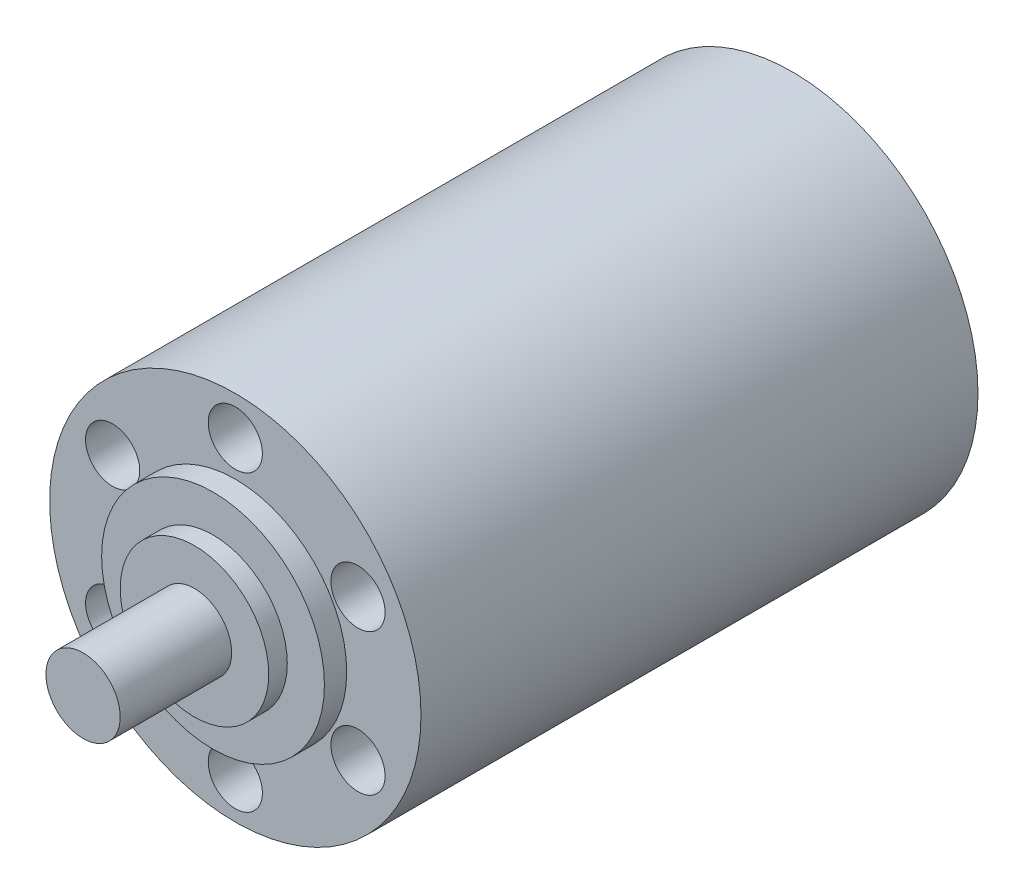
ISO-10303-21;
HEADER;
FILE_DESCRIPTION(('STEP AP214'),'2;1');
FILE_NAME('part.step','',(''),(''),'','','');
FILE_SCHEMA(('AUTOMOTIVE_DESIGN { 1 0 10303 214 1 1 1 1 }'));
ENDSEC;
DATA;
#1=APPLICATION_CONTEXT('core data for automotive mechanical design processes');
#2=APPLICATION_PROTOCOL_DEFINITION('international standard','automotive_design',2000,#1);
#3=PRODUCT_CONTEXT('',#1,'mechanical');
#4=PRODUCT('Part','Part','',(#3));
#5=PRODUCT_RELATED_PRODUCT_CATEGORY('part','',(#4));
#6=PRODUCT_DEFINITION_FORMATION('','',#4);
#7=PRODUCT_DEFINITION_CONTEXT('part definition',#1,'design');
#8=PRODUCT_DEFINITION('design','',#6,#7);
#9=PRODUCT_DEFINITION_SHAPE('','',#8);
#10=(LENGTH_UNIT() NAMED_UNIT(*) SI_UNIT(.MILLI.,.METRE.));
#11=(NAMED_UNIT(*) PLANE_ANGLE_UNIT() SI_UNIT($,.RADIAN.));
#12=(NAMED_UNIT(*) SI_UNIT($,.STERADIAN.) SOLID_ANGLE_UNIT());
#13=UNCERTAINTY_MEASURE_WITH_UNIT(LENGTH_MEASURE(1.E-05),#10,'distance_accuracy_value','');
#14=(GEOMETRIC_REPRESENTATION_CONTEXT(3) GLOBAL_UNCERTAINTY_ASSIGNED_CONTEXT((#13)) GLOBAL_UNIT_ASSIGNED_CONTEXT((#10,
#11,#12)) REPRESENTATION_CONTEXT('',''));
#15=CARTESIAN_POINT('',(0.,0.,0.));
#16=DIRECTION('',(0.,0.,1.));
#17=DIRECTION('',(1.,0.,0.));
#18=AXIS2_PLACEMENT_3D('',#15,#16,#17);
#19=CARTESIAN_POINT('',(0.,0.,150.));
#20=DIRECTION('',(0.,0.,-1.));
#21=DIRECTION('',(-1.,0.,0.));
#22=AXIS2_PLACEMENT_3D('',#19,#20,#21);
#23=CYLINDRICAL_SURFACE('',#22,50.);
#24=CARTESIAN_POINT('',(0.,0.,150.));
#25=DIRECTION('',(0.,0.,1.));
#26=DIRECTION('',(1.,0.,0.));
#27=AXIS2_PLACEMENT_3D('',#24,#25,#26);
#28=CIRCLE('',#27,50.);
#29=CARTESIAN_POINT('',(50.,0.,150.));
#30=VERTEX_POINT('',#29);
#31=EDGE_CURVE('E58',#30,#30,#28,.T.);
#32=ORIENTED_EDGE('',*,*,#31,.F.);
#33=EDGE_LOOP('',(#32));
#34=FACE_BOUND('',#33,.T.);
#35=CARTESIAN_POINT('',(0.,0.,0.));
#36=DIRECTION('',(0.,0.,1.));
#37=DIRECTION('',(1.,0.,0.));
#38=AXIS2_PLACEMENT_3D('',#35,#36,#37);
#39=CIRCLE('',#38,50.);
#40=CARTESIAN_POINT('',(50.,0.,0.));
#41=VERTEX_POINT('',#40);
#42=EDGE_CURVE('E36',#41,#41,#39,.T.);
#43=ORIENTED_EDGE('',*,*,#42,.T.);
#44=EDGE_LOOP('',(#43));
#45=FACE_BOUND('',#44,.T.);
#46=ADVANCED_FACE('F33',(#34,#45),#23,.T.);
#47=CARTESIAN_POINT('',(0.,0.,150.));
#48=DIRECTION('',(0.,0.,1.));
#49=DIRECTION('',(1.,0.,0.));
#50=AXIS2_PLACEMENT_3D('',#47,#48,#49);
#51=PLANE('',#50);
#52=CARTESIAN_POINT('',(0.,39.5741246169116,150.));
#53=DIRECTION('',(0.,0.,1.));
#54=DIRECTION('',(1.,0.,0.));
#55=AXIS2_PLACEMENT_3D('',#52,#53,#54);
#56=CIRCLE('',#55,7.29301710738582);
#57=CARTESIAN_POINT('',(7.29301710738582,39.5741246169116,150.));
#58=VERTEX_POINT('',#57);
#59=EDGE_CURVE('E283',#58,#58,#56,.T.);
#60=ORIENTED_EDGE('',*,*,#59,.F.);
#61=EDGE_LOOP('',(#60));
#62=FACE_BOUND('',#61,.T.);
#63=CARTESIAN_POINT('',(-33.0372685802872,-19.0740759081187,150.));
#64=DIRECTION('',(0.,0.,1.));
#65=DIRECTION('',(1.,0.,0.));
#66=AXIS2_PLACEMENT_3D('',#63,#64,#65);
#67=CIRCLE('',#66,7.29301710738582);
#68=CARTESIAN_POINT('',(-25.7442514729014,-19.0740759081187,150.));
#69=VERTEX_POINT('',#68);
#70=EDGE_CURVE('E294',#69,#69,#67,.T.);
#71=ORIENTED_EDGE('',*,*,#70,.F.);
#72=EDGE_LOOP('',(#71));
#73=FACE_BOUND('',#72,.T.);
#74=CARTESIAN_POINT('',(33.0372685802872,19.0740759081187,150.));
#75=DIRECTION('',(0.,0.,1.));
#76=DIRECTION('',(1.,0.,0.));
#77=AXIS2_PLACEMENT_3D('',#74,#75,#76);
#78=CIRCLE('',#77,7.29301710738582);
#79=CARTESIAN_POINT('',(40.330285687673,19.0740759081187,150.));
#80=VERTEX_POINT('',#79);
#81=EDGE_CURVE('E311',#80,#80,#78,.T.);
#82=ORIENTED_EDGE('',*,*,#81,.F.);
#83=EDGE_LOOP('',(#82));
#84=FACE_BOUND('',#83,.T.);
#85=CARTESIAN_POINT('',(0.,-39.5741246169116,150.));
#86=DIRECTION('',(0.,0.,1.));
#87=DIRECTION('',(-1.,0.,0.));
#88=AXIS2_PLACEMENT_3D('',#85,#86,#87);
#89=CIRCLE('',#88,7.29301710738582);
#90=CARTESIAN_POINT('',(-7.29301710738582,-39.5741246169116,150.));
#91=VERTEX_POINT('',#90);
#92=EDGE_CURVE('E300',#91,#91,#89,.T.);
#93=ORIENTED_EDGE('',*,*,#92,.F.);
#94=EDGE_LOOP('',(#93));
#95=FACE_BOUND('',#94,.T.);
#96=CARTESIAN_POINT('',(-33.0372685802872,19.0740759081187,150.));
#97=DIRECTION('',(0.,0.,1.));
#98=DIRECTION('',(-1.,0.,0.));
#99=AXIS2_PLACEMENT_3D('',#96,#97,#98);
#100=CIRCLE('',#99,7.29301710738582);
#101=CARTESIAN_POINT('',(-40.330285687673,19.0740759081187,150.));
#102=VERTEX_POINT('',#101);
#103=EDGE_CURVE('E301',#102,#102,#100,.T.);
#104=ORIENTED_EDGE('',*,*,#103,.F.);
#105=EDGE_LOOP('',(#104));
#106=FACE_BOUND('',#105,.T.);
#107=CARTESIAN_POINT('',(33.0372685802872,-19.0740759081187,150.));
#108=DIRECTION('',(0.,0.,1.));
#109=DIRECTION('',(-1.,0.,0.));
#110=AXIS2_PLACEMENT_3D('',#107,#108,#109);
#111=CIRCLE('',#110,7.29301710738582);
#112=CARTESIAN_POINT('',(25.7442514729014,-19.0740759081187,150.));
#113=VERTEX_POINT('',#112);
#114=EDGE_CURVE('E293',#113,#113,#111,.T.);
#115=ORIENTED_EDGE('',*,*,#114,.F.);
#116=EDGE_LOOP('',(#115));
#117=FACE_BOUND('',#116,.T.);
#118=CARTESIAN_POINT('',(0.,0.,150.));
#119=DIRECTION('',(0.,0.,1.));
#120=DIRECTION('',(1.,0.,0.));
#121=AXIS2_PLACEMENT_3D('',#118,#119,#120);
#122=CIRCLE('',#121,30.);
#123=CARTESIAN_POINT('',(30.,0.,150.));
#124=VERTEX_POINT('',#123);
#125=EDGE_CURVE('E45',#124,#124,#122,.T.);
#126=ORIENTED_EDGE('',*,*,#125,.F.);
#127=EDGE_LOOP('',(#126));
#128=FACE_BOUND('',#127,.T.);
#129=ORIENTED_EDGE('',*,*,#31,.T.);
#130=EDGE_LOOP('',(#129));
#131=FACE_BOUND('',#130,.T.);
#132=ADVANCED_FACE('F69',(#62,#73,#84,#95,#106,#117,#128,#131),#51,.T.);
#133=CARTESIAN_POINT('',(0.,0.,0.));
#134=DIRECTION('',(0.,0.,1.));
#135=DIRECTION('',(1.,0.,0.));
#136=AXIS2_PLACEMENT_3D('',#133,#134,#135);
#137=PLANE('',#136);
#138=ORIENTED_EDGE('',*,*,#42,.F.);
#139=EDGE_LOOP('',(#138));
#140=FACE_BOUND('',#139,.T.);
#141=ADVANCED_FACE('F66',(#140),#137,.F.);
#142=CARTESIAN_POINT('',(0.,0.,156.));
#143=DIRECTION('',(0.,0.,-1.));
#144=DIRECTION('',(-1.,0.,0.));
#145=AXIS2_PLACEMENT_3D('',#142,#143,#144);
#146=CYLINDRICAL_SURFACE('',#145,30.);
#147=CARTESIAN_POINT('',(0.,0.,156.));
#148=DIRECTION('',(0.,0.,1.));
#149=DIRECTION('',(1.,0.,0.));
#150=AXIS2_PLACEMENT_3D('',#147,#148,#149);
#151=CIRCLE('',#150,30.);
#152=CARTESIAN_POINT('',(30.,0.,156.));
#153=VERTEX_POINT('',#152);
#154=EDGE_CURVE('E53',#153,#153,#151,.T.);
#155=ORIENTED_EDGE('',*,*,#154,.F.);
#156=EDGE_LOOP('',(#155));
#157=FACE_BOUND('',#156,.T.);
#158=ORIENTED_EDGE('',*,*,#125,.T.);
#159=EDGE_LOOP('',(#158));
#160=FACE_BOUND('',#159,.T.);
#161=ADVANCED_FACE('F68',(#157,#160),#146,.T.);
#162=CARTESIAN_POINT('',(0.,0.,156.));
#163=DIRECTION('',(0.,0.,1.));
#164=DIRECTION('',(1.,0.,0.));
#165=AXIS2_PLACEMENT_3D('',#162,#163,#164);
#166=PLANE('',#165);
#167=CARTESIAN_POINT('',(0.,0.,156.));
#168=DIRECTION('',(0.,0.,1.));
#169=DIRECTION('',(1.,0.,0.));
#170=AXIS2_PLACEMENT_3D('',#167,#168,#169);
#171=CIRCLE('',#170,20.);
#172=CARTESIAN_POINT('',(20.,0.,156.));
#173=VERTEX_POINT('',#172);
#174=EDGE_CURVE('E40',#173,#173,#171,.T.);
#175=ORIENTED_EDGE('',*,*,#174,.F.);
#176=EDGE_LOOP('',(#175));
#177=FACE_BOUND('',#176,.T.);
#178=ORIENTED_EDGE('',*,*,#154,.T.);
#179=EDGE_LOOP('',(#178));
#180=FACE_BOUND('',#179,.T.);
#181=ADVANCED_FACE('F74',(#177,#180),#166,.T.);
#182=CARTESIAN_POINT('',(0.,0.,161.));
#183=DIRECTION('',(0.,0.,-1.));
#184=DIRECTION('',(-1.,0.,0.));
#185=AXIS2_PLACEMENT_3D('',#182,#183,#184);
#186=CYLINDRICAL_SURFACE('',#185,20.);
#187=CARTESIAN_POINT('',(0.,0.,161.));
#188=DIRECTION('',(0.,0.,1.));
#189=DIRECTION('',(1.,0.,0.));
#190=AXIS2_PLACEMENT_3D('',#187,#188,#189);
#191=CIRCLE('',#190,20.);
#192=CARTESIAN_POINT('',(20.,0.,161.));
#193=VERTEX_POINT('',#192);
#194=EDGE_CURVE('E51',#193,#193,#191,.T.);
#195=ORIENTED_EDGE('',*,*,#194,.F.);
#196=EDGE_LOOP('',(#195));
#197=FACE_BOUND('',#196,.T.);
#198=ORIENTED_EDGE('',*,*,#174,.T.);
#199=EDGE_LOOP('',(#198));
#200=FACE_BOUND('',#199,.T.);
#201=ADVANCED_FACE('F229',(#197,#200),#186,.T.);
#202=CARTESIAN_POINT('',(0.,0.,161.));
#203=DIRECTION('',(0.,0.,1.));
#204=DIRECTION('',(1.,0.,0.));
#205=AXIS2_PLACEMENT_3D('',#202,#203,#204);
#206=PLANE('',#205);
#207=CARTESIAN_POINT('',(0.,0.,161.));
#208=DIRECTION('',(0.,0.,1.));
#209=DIRECTION('',(1.,0.,0.));
#210=AXIS2_PLACEMENT_3D('',#207,#208,#209);
#211=CIRCLE('',#210,10.);
#212=CARTESIAN_POINT('',(10.,0.,161.));
#213=VERTEX_POINT('',#212);
#214=EDGE_CURVE('E10',#213,#213,#211,.T.);
#215=ORIENTED_EDGE('',*,*,#214,.F.);
#216=EDGE_LOOP('',(#215));
#217=FACE_BOUND('',#216,.T.);
#218=ORIENTED_EDGE('',*,*,#194,.T.);
#219=EDGE_LOOP('',(#218));
#220=FACE_BOUND('',#219,.T.);
#221=ADVANCED_FACE('F225',(#217,#220),#206,.T.);
#222=CARTESIAN_POINT('',(0.,0.,191.));
#223=DIRECTION('',(0.,0.,-1.));
#224=DIRECTION('',(-1.,0.,0.));
#225=AXIS2_PLACEMENT_3D('',#222,#223,#224);
#226=CYLINDRICAL_SURFACE('',#225,10.);
#227=CARTESIAN_POINT('',(0.,0.,191.));
#228=DIRECTION('',(0.,0.,1.));
#229=DIRECTION('',(1.,0.,0.));
#230=AXIS2_PLACEMENT_3D('',#227,#228,#229);
#231=CIRCLE('',#230,10.);
#232=CARTESIAN_POINT('',(10.,0.,191.));
#233=VERTEX_POINT('',#232);
#234=EDGE_CURVE('E49',#233,#233,#231,.T.);
#235=ORIENTED_EDGE('',*,*,#234,.F.);
#236=EDGE_LOOP('',(#235));
#237=FACE_BOUND('',#236,.T.);
#238=ORIENTED_EDGE('',*,*,#214,.T.);
#239=EDGE_LOOP('',(#238));
#240=FACE_BOUND('',#239,.T.);
#241=ADVANCED_FACE('F221',(#237,#240),#226,.T.);
#242=CARTESIAN_POINT('',(0.,0.,191.));
#243=DIRECTION('',(0.,0.,1.));
#244=DIRECTION('',(1.,0.,0.));
#245=AXIS2_PLACEMENT_3D('',#242,#243,#244);
#246=PLANE('',#245);
#247=ORIENTED_EDGE('',*,*,#234,.T.);
#248=EDGE_LOOP('',(#247));
#249=FACE_BOUND('',#248,.T.);
#250=ADVANCED_FACE('F94',(#249),#246,.T.);
#251=CARTESIAN_POINT('',(33.0372685802872,-19.0740759081187,130.));
#252=DIRECTION('',(0.,0.,1.));
#253=DIRECTION('',(1.,0.,0.));
#254=AXIS2_PLACEMENT_3D('',#251,#252,#253);
#255=CYLINDRICAL_SURFACE('',#254,7.29301710738582);
#256=CARTESIAN_POINT('',(33.0372685802872,-19.0740759081187,130.));
#257=DIRECTION('',(0.,0.,1.));
#258=DIRECTION('',(-1.,0.,0.));
#259=AXIS2_PLACEMENT_3D('',#256,#257,#258);
#260=CIRCLE('',#259,7.29301710738582);
#261=CARTESIAN_POINT('',(25.7442514729014,-19.0740759081187,130.));
#262=VERTEX_POINT('',#261);
#263=EDGE_CURVE('E304',#262,#262,#260,.T.);
#264=ORIENTED_EDGE('',*,*,#263,.F.);
#265=EDGE_LOOP('',(#264));
#266=FACE_BOUND('',#265,.T.);
#267=ORIENTED_EDGE('',*,*,#114,.T.);
#268=EDGE_LOOP('',(#267));
#269=FACE_BOUND('',#268,.T.);
#270=ADVANCED_FACE('F99',(#266,#269),#255,.F.);
#271=CARTESIAN_POINT('',(33.0372685802872,-19.0740759081187,130.));
#272=DIRECTION('',(0.,0.,-1.));
#273=DIRECTION('',(-1.,0.,0.));
#274=AXIS2_PLACEMENT_3D('',#271,#272,#273);
#275=PLANE('',#274);
#276=ORIENTED_EDGE('',*,*,#263,.T.);
#277=EDGE_LOOP('',(#276));
#278=FACE_BOUND('',#277,.T.);
#279=ADVANCED_FACE('F104',(#278),#275,.F.);
#280=CARTESIAN_POINT('',(-33.0372685802872,19.0740759081187,130.));
#281=DIRECTION('',(0.,0.,1.));
#282=DIRECTION('',(1.,0.,0.));
#283=AXIS2_PLACEMENT_3D('',#280,#281,#282);
#284=CYLINDRICAL_SURFACE('',#283,7.29301710738582);
#285=CARTESIAN_POINT('',(-33.0372685802872,19.0740759081187,130.));
#286=DIRECTION('',(0.,0.,1.));
#287=DIRECTION('',(-1.,0.,0.));
#288=AXIS2_PLACEMENT_3D('',#285,#286,#287);
#289=CIRCLE('',#288,7.29301710738582);
#290=CARTESIAN_POINT('',(-40.330285687673,19.0740759081187,130.));
#291=VERTEX_POINT('',#290);
#292=EDGE_CURVE('E297',#291,#291,#289,.T.);
#293=ORIENTED_EDGE('',*,*,#292,.F.);
#294=EDGE_LOOP('',(#293));
#295=FACE_BOUND('',#294,.T.);
#296=ORIENTED_EDGE('',*,*,#103,.T.);
#297=EDGE_LOOP('',(#296));
#298=FACE_BOUND('',#297,.T.);
#299=ADVANCED_FACE('F114',(#295,#298),#284,.F.);
#300=CARTESIAN_POINT('',(-33.0372685802872,19.0740759081187,130.));
#301=DIRECTION('',(0.,0.,-1.));
#302=DIRECTION('',(-1.,0.,0.));
#303=AXIS2_PLACEMENT_3D('',#300,#301,#302);
#304=PLANE('',#303);
#305=ORIENTED_EDGE('',*,*,#292,.T.);
#306=EDGE_LOOP('',(#305));
#307=FACE_BOUND('',#306,.T.);
#308=ADVANCED_FACE('F124',(#307),#304,.F.);
#309=CARTESIAN_POINT('',(0.,-39.5741246169116,130.));
#310=DIRECTION('',(0.,0.,1.));
#311=DIRECTION('',(1.,0.,0.));
#312=AXIS2_PLACEMENT_3D('',#309,#310,#311);
#313=CYLINDRICAL_SURFACE('',#312,7.29301710738582);
#314=CARTESIAN_POINT('',(0.,-39.5741246169116,130.));
#315=DIRECTION('',(0.,0.,1.));
#316=DIRECTION('',(-1.,0.,0.));
#317=AXIS2_PLACEMENT_3D('',#314,#315,#316);
#318=CIRCLE('',#317,7.29301710738582);
#319=CARTESIAN_POINT('',(-7.29301710738582,-39.5741246169116,130.));
#320=VERTEX_POINT('',#319);
#321=EDGE_CURVE('E314',#320,#320,#318,.T.);
#322=ORIENTED_EDGE('',*,*,#321,.F.);
#323=EDGE_LOOP('',(#322));
#324=FACE_BOUND('',#323,.T.);
#325=ORIENTED_EDGE('',*,*,#92,.T.);
#326=EDGE_LOOP('',(#325));
#327=FACE_BOUND('',#326,.T.);
#328=ADVANCED_FACE('F134',(#324,#327),#313,.F.);
#329=CARTESIAN_POINT('',(0.,-39.5741246169116,130.));
#330=DIRECTION('',(0.,0.,-1.));
#331=DIRECTION('',(-1.,0.,0.));
#332=AXIS2_PLACEMENT_3D('',#329,#330,#331);
#333=PLANE('',#332);
#334=ORIENTED_EDGE('',*,*,#321,.T.);
#335=EDGE_LOOP('',(#334));
#336=FACE_BOUND('',#335,.T.);
#337=ADVANCED_FACE('F144',(#336),#333,.F.);
#338=CARTESIAN_POINT('',(33.0372685802872,19.0740759081187,130.));
#339=DIRECTION('',(0.,0.,1.));
#340=DIRECTION('',(1.,0.,0.));
#341=AXIS2_PLACEMENT_3D('',#338,#339,#340);
#342=CYLINDRICAL_SURFACE('',#341,7.29301710738582);
#343=CARTESIAN_POINT('',(33.0372685802872,19.0740759081187,130.));
#344=DIRECTION('',(0.,0.,1.));
#345=DIRECTION('',(1.,0.,0.));
#346=AXIS2_PLACEMENT_3D('',#343,#344,#345);
#347=CIRCLE('',#346,7.29301710738582);
#348=CARTESIAN_POINT('',(40.330285687673,19.0740759081187,130.));
#349=VERTEX_POINT('',#348);
#350=EDGE_CURVE('E287',#349,#349,#347,.T.);
#351=ORIENTED_EDGE('',*,*,#350,.F.);
#352=EDGE_LOOP('',(#351));
#353=FACE_BOUND('',#352,.T.);
#354=ORIENTED_EDGE('',*,*,#81,.T.);
#355=EDGE_LOOP('',(#354));
#356=FACE_BOUND('',#355,.T.);
#357=ADVANCED_FACE('F154',(#353,#356),#342,.F.);
#358=CARTESIAN_POINT('',(33.0372685802872,19.0740759081187,130.));
#359=DIRECTION('',(0.,0.,1.));
#360=DIRECTION('',(1.,0.,0.));
#361=AXIS2_PLACEMENT_3D('',#358,#359,#360);
#362=PLANE('',#361);
#363=ORIENTED_EDGE('',*,*,#350,.T.);
#364=EDGE_LOOP('',(#363));
#365=FACE_BOUND('',#364,.T.);
#366=ADVANCED_FACE('F164',(#365),#362,.T.);
#367=CARTESIAN_POINT('',(-33.0372685802872,-19.0740759081187,130.));
#368=DIRECTION('',(0.,0.,1.));
#369=DIRECTION('',(1.,0.,0.));
#370=AXIS2_PLACEMENT_3D('',#367,#368,#369);
#371=CYLINDRICAL_SURFACE('',#370,7.29301710738582);
#372=CARTESIAN_POINT('',(-33.0372685802872,-19.0740759081187,130.));
#373=DIRECTION('',(0.,0.,1.));
#374=DIRECTION('',(1.,0.,0.));
#375=AXIS2_PLACEMENT_3D('',#372,#373,#374);
#376=CIRCLE('',#375,7.29301710738582);
#377=CARTESIAN_POINT('',(-25.7442514729014,-19.0740759081187,130.));
#378=VERTEX_POINT('',#377);
#379=EDGE_CURVE('E290',#378,#378,#376,.T.);
#380=ORIENTED_EDGE('',*,*,#379,.F.);
#381=EDGE_LOOP('',(#380));
#382=FACE_BOUND('',#381,.T.);
#383=ORIENTED_EDGE('',*,*,#70,.T.);
#384=EDGE_LOOP('',(#383));
#385=FACE_BOUND('',#384,.T.);
#386=ADVANCED_FACE('F174',(#382,#385),#371,.F.);
#387=CARTESIAN_POINT('',(-33.0372685802872,-19.0740759081187,130.));
#388=DIRECTION('',(0.,0.,1.));
#389=DIRECTION('',(1.,0.,0.));
#390=AXIS2_PLACEMENT_3D('',#387,#388,#389);
#391=PLANE('',#390);
#392=ORIENTED_EDGE('',*,*,#379,.T.);
#393=EDGE_LOOP('',(#392));
#394=FACE_BOUND('',#393,.T.);
#395=ADVANCED_FACE('F184',(#394),#391,.T.);
#396=CARTESIAN_POINT('',(0.,39.5741246169116,130.));
#397=DIRECTION('',(0.,0.,1.));
#398=DIRECTION('',(1.,0.,0.));
#399=AXIS2_PLACEMENT_3D('',#396,#397,#398);
#400=CYLINDRICAL_SURFACE('',#399,7.29301710738582);
#401=CARTESIAN_POINT('',(0.,39.5741246169116,130.));
#402=DIRECTION('',(0.,0.,1.));
#403=DIRECTION('',(1.,0.,0.));
#404=AXIS2_PLACEMENT_3D('',#401,#402,#403);
#405=CIRCLE('',#404,7.29301710738582);
#406=CARTESIAN_POINT('',(7.29301710738582,39.5741246169116,130.));
#407=VERTEX_POINT('',#406);
#408=EDGE_CURVE('E282',#407,#407,#405,.T.);
#409=ORIENTED_EDGE('',*,*,#408,.F.);
#410=EDGE_LOOP('',(#409));
#411=FACE_BOUND('',#410,.T.);
#412=ORIENTED_EDGE('',*,*,#59,.T.);
#413=EDGE_LOOP('',(#412));
#414=FACE_BOUND('',#413,.T.);
#415=ADVANCED_FACE('F194',(#411,#414),#400,.F.);
#416=CARTESIAN_POINT('',(0.,39.5741246169116,130.));
#417=DIRECTION('',(0.,0.,1.));
#418=DIRECTION('',(1.,0.,0.));
#419=AXIS2_PLACEMENT_3D('',#416,#417,#418);
#420=PLANE('',#419);
#421=ORIENTED_EDGE('',*,*,#408,.T.);
#422=EDGE_LOOP('',(#421));
#423=FACE_BOUND('',#422,.T.);
#424=ADVANCED_FACE('F204',(#423),#420,.T.);
#425=CLOSED_SHELL('',(#46,#132,#141,#161,#181,#201,#221,#241,#250,#270,#279,#299,#308,#328,#337,
#357,#366,#386,#395,#415,#424));
#426=MANIFOLD_SOLID_BREP('B2',#425);
#427=ADVANCED_BREP_SHAPE_REPRESENTATION('',(#18,#426),#14);
#428=SHAPE_DEFINITION_REPRESENTATION(#9,#427);
ENDSEC;
END-ISO-10303-21;
